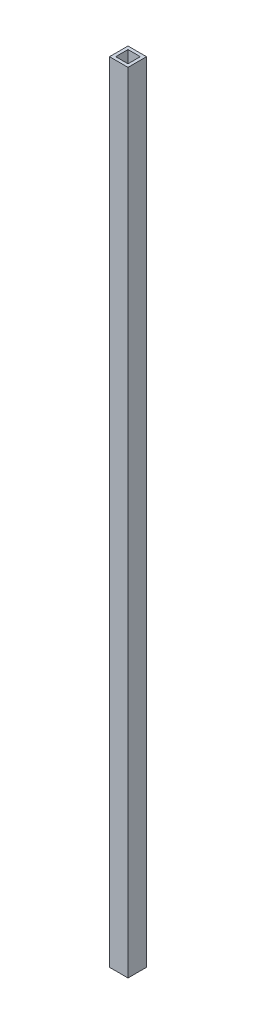
ISO-10303-21;
HEADER;
FILE_DESCRIPTION(('STEP AP214'),'2;1');
FILE_NAME('part.step','',(''),(''),'','','');
FILE_SCHEMA(('AUTOMOTIVE_DESIGN { 1 0 10303 214 1 1 1 1 }'));
ENDSEC;
DATA;
#1=APPLICATION_CONTEXT('core data for automotive mechanical design processes');
#2=APPLICATION_PROTOCOL_DEFINITION('international standard','automotive_design',2000,#1);
#3=PRODUCT_CONTEXT('',#1,'mechanical');
#4=PRODUCT('Part','Part','',(#3));
#5=PRODUCT_RELATED_PRODUCT_CATEGORY('part','',(#4));
#6=PRODUCT_DEFINITION_FORMATION('','',#4);
#7=PRODUCT_DEFINITION_CONTEXT('part definition',#1,'design');
#8=PRODUCT_DEFINITION('design','',#6,#7);
#9=PRODUCT_DEFINITION_SHAPE('','',#8);
#10=(LENGTH_UNIT() NAMED_UNIT(*) SI_UNIT(.MILLI.,.METRE.));
#11=(NAMED_UNIT(*) PLANE_ANGLE_UNIT() SI_UNIT($,.RADIAN.));
#12=(NAMED_UNIT(*) SI_UNIT($,.STERADIAN.) SOLID_ANGLE_UNIT());
#13=UNCERTAINTY_MEASURE_WITH_UNIT(LENGTH_MEASURE(1.E-05),#10,'distance_accuracy_value','');
#14=(GEOMETRIC_REPRESENTATION_CONTEXT(3) GLOBAL_UNCERTAINTY_ASSIGNED_CONTEXT((#13)) GLOBAL_UNIT_ASSIGNED_CONTEXT((#10,
#11,#12)) REPRESENTATION_CONTEXT('',''));
#15=CARTESIAN_POINT('',(0.,0.,0.));
#16=DIRECTION('',(0.,0.,1.));
#17=DIRECTION('',(1.,0.,0.));
#18=AXIS2_PLACEMENT_3D('',#15,#16,#17);
#19=CARTESIAN_POINT('',(0.,812.8,0.));
#20=DIRECTION('',(0.,1.,0.));
#21=DIRECTION('',(0.,0.,1.));
#22=AXIS2_PLACEMENT_3D('',#19,#20,#21);
#23=PLANE('',#22);
#24=DIRECTION('',(0.,0.,1.));
#25=VECTOR('',#24,1.);
#26=CARTESIAN_POINT('',(0.,812.8,0.));
#27=LINE('',#26,#25);
#28=CARTESIAN_POINT('',(0.,812.8,-19.05));
#29=VERTEX_POINT('',#28);
#30=CARTESIAN_POINT('',(0.,812.8,0.));
#31=VERTEX_POINT('',#30);
#32=EDGE_CURVE('E158',#29,#31,#27,.T.);
#33=ORIENTED_EDGE('',*,*,#32,.T.);
#34=DIRECTION('',(1.,0.,0.));
#35=VECTOR('',#34,1.);
#36=CARTESIAN_POINT('',(0.,812.8,0.));
#37=LINE('',#36,#35);
#38=CARTESIAN_POINT('',(19.05,812.8,0.));
#39=VERTEX_POINT('',#38);
#40=EDGE_CURVE('E161',#31,#39,#37,.T.);
#41=ORIENTED_EDGE('',*,*,#40,.T.);
#42=DIRECTION('',(0.,0.,-1.));
#43=VECTOR('',#42,1.);
#44=CARTESIAN_POINT('',(19.05,812.8,0.));
#45=LINE('',#44,#43);
#46=CARTESIAN_POINT('',(19.05,812.8,-19.05));
#47=VERTEX_POINT('',#46);
#48=EDGE_CURVE('E164',#39,#47,#45,.T.);
#49=ORIENTED_EDGE('',*,*,#48,.T.);
#50=DIRECTION('',(-1.,0.,0.));
#51=VECTOR('',#50,1.);
#52=CARTESIAN_POINT('',(0.,812.8,-19.05));
#53=LINE('',#52,#51);
#54=EDGE_CURVE('E166',#47,#29,#53,.T.);
#55=ORIENTED_EDGE('',*,*,#54,.T.);
#56=EDGE_LOOP('',(#33,#41,#49,#55));
#57=FACE_BOUND('',#56,.T.);
#58=DIRECTION('',(1.,0.,0.));
#59=VECTOR('',#58,1.);
#60=CARTESIAN_POINT('',(0.,812.8,-3.175));
#61=LINE('',#60,#59);
#62=CARTESIAN_POINT('',(3.175,812.8,-3.175));
#63=VERTEX_POINT('',#62);
#64=CARTESIAN_POINT('',(15.875,812.8,-3.175));
#65=VERTEX_POINT('',#64);
#66=EDGE_CURVE('E130',#63,#65,#61,.T.);
#67=ORIENTED_EDGE('',*,*,#66,.F.);
#68=DIRECTION('',(0.,0.,1.));
#69=VECTOR('',#68,1.);
#70=CARTESIAN_POINT('',(3.175,812.8,0.));
#71=LINE('',#70,#69);
#72=CARTESIAN_POINT('',(3.175,812.8,-15.875));
#73=VERTEX_POINT('',#72);
#74=EDGE_CURVE('E122',#73,#63,#71,.T.);
#75=ORIENTED_EDGE('',*,*,#74,.F.);
#76=DIRECTION('',(-1.,0.,0.));
#77=VECTOR('',#76,1.);
#78=CARTESIAN_POINT('',(0.,812.8,-15.875));
#79=LINE('',#78,#77);
#80=CARTESIAN_POINT('',(15.875,812.8,-15.875));
#81=VERTEX_POINT('',#80);
#82=EDGE_CURVE('E144',#81,#73,#79,.T.);
#83=ORIENTED_EDGE('',*,*,#82,.F.);
#84=DIRECTION('',(0.,0.,-1.));
#85=VECTOR('',#84,1.);
#86=CARTESIAN_POINT('',(15.875,812.8,0.));
#87=LINE('',#86,#85);
#88=EDGE_CURVE('E142',#65,#81,#87,.T.);
#89=ORIENTED_EDGE('',*,*,#88,.F.);
#90=EDGE_LOOP('',(#67,#75,#83,#89));
#91=FACE_BOUND('',#90,.T.);
#92=ADVANCED_FACE('F57',(#57,#91),#23,.T.);
#93=CARTESIAN_POINT('',(0.,0.,0.));
#94=DIRECTION('',(0.,1.,0.));
#95=DIRECTION('',(0.,0.,1.));
#96=AXIS2_PLACEMENT_3D('',#93,#94,#95);
#97=PLANE('',#96);
#98=DIRECTION('',(0.,0.,1.));
#99=VECTOR('',#98,1.);
#100=CARTESIAN_POINT('',(0.,0.,0.));
#101=LINE('',#100,#99);
#102=CARTESIAN_POINT('',(0.,0.,-19.05));
#103=VERTEX_POINT('',#102);
#104=CARTESIAN_POINT('',(0.,0.,0.));
#105=VERTEX_POINT('',#104);
#106=EDGE_CURVE('E138',#103,#105,#101,.T.);
#107=ORIENTED_EDGE('',*,*,#106,.F.);
#108=DIRECTION('',(-1.,0.,0.));
#109=VECTOR('',#108,1.);
#110=CARTESIAN_POINT('',(0.,0.,-19.05));
#111=LINE('',#110,#109);
#112=CARTESIAN_POINT('',(19.05,0.,-19.05));
#113=VERTEX_POINT('',#112);
#114=EDGE_CURVE('E162',#113,#103,#111,.T.);
#115=ORIENTED_EDGE('',*,*,#114,.F.);
#116=DIRECTION('',(0.,0.,-1.));
#117=VECTOR('',#116,1.);
#118=CARTESIAN_POINT('',(19.05,0.,0.));
#119=LINE('',#118,#117);
#120=CARTESIAN_POINT('',(19.05,0.,0.));
#121=VERTEX_POINT('',#120);
#122=EDGE_CURVE('E173',#121,#113,#119,.T.);
#123=ORIENTED_EDGE('',*,*,#122,.F.);
#124=DIRECTION('',(1.,0.,0.));
#125=VECTOR('',#124,1.);
#126=CARTESIAN_POINT('',(0.,0.,0.));
#127=LINE('',#126,#125);
#128=EDGE_CURVE('E171',#105,#121,#127,.T.);
#129=ORIENTED_EDGE('',*,*,#128,.F.);
#130=EDGE_LOOP('',(#107,#115,#123,#129));
#131=FACE_BOUND('',#130,.T.);
#132=DIRECTION('',(0.,0.,1.));
#133=VECTOR('',#132,1.);
#134=CARTESIAN_POINT('',(3.175,0.,0.));
#135=LINE('',#134,#133);
#136=CARTESIAN_POINT('',(3.175,0.,-15.875));
#137=VERTEX_POINT('',#136);
#138=CARTESIAN_POINT('',(3.175,0.,-3.175));
#139=VERTEX_POINT('',#138);
#140=EDGE_CURVE('E80',#137,#139,#135,.T.);
#141=ORIENTED_EDGE('',*,*,#140,.T.);
#142=DIRECTION('',(1.,0.,0.));
#143=VECTOR('',#142,1.);
#144=CARTESIAN_POINT('',(0.,0.,-3.175));
#145=LINE('',#144,#143);
#146=CARTESIAN_POINT('',(15.875,0.,-3.175));
#147=VERTEX_POINT('',#146);
#148=EDGE_CURVE('E137',#139,#147,#145,.T.);
#149=ORIENTED_EDGE('',*,*,#148,.T.);
#150=DIRECTION('',(0.,0.,-1.));
#151=VECTOR('',#150,1.);
#152=CARTESIAN_POINT('',(15.875,0.,0.));
#153=LINE('',#152,#151);
#154=CARTESIAN_POINT('',(15.875,0.,-15.875));
#155=VERTEX_POINT('',#154);
#156=EDGE_CURVE('E150',#147,#155,#153,.T.);
#157=ORIENTED_EDGE('',*,*,#156,.T.);
#158=DIRECTION('',(-1.,0.,0.));
#159=VECTOR('',#158,1.);
#160=CARTESIAN_POINT('',(0.,0.,-15.875));
#161=LINE('',#160,#159);
#162=EDGE_CURVE('E131',#155,#137,#161,.T.);
#163=ORIENTED_EDGE('',*,*,#162,.T.);
#164=EDGE_LOOP('',(#141,#149,#157,#163));
#165=FACE_BOUND('',#164,.T.);
#166=ADVANCED_FACE('F191',(#131,#165),#97,.F.);
#167=CARTESIAN_POINT('',(0.,812.8,0.));
#168=DIRECTION('',(1.,0.,0.));
#169=DIRECTION('',(0.,0.,-1.));
#170=AXIS2_PLACEMENT_3D('',#167,#168,#169);
#171=PLANE('',#170);
#172=ORIENTED_EDGE('',*,*,#106,.T.);
#173=DIRECTION('',(0.,-1.,0.));
#174=VECTOR('',#173,1.);
#175=CARTESIAN_POINT('',(0.,812.8,0.));
#176=LINE('',#175,#174);
#177=EDGE_CURVE('E12',#31,#105,#176,.T.);
#178=ORIENTED_EDGE('',*,*,#177,.F.);
#179=ORIENTED_EDGE('',*,*,#32,.F.);
#180=DIRECTION('',(0.,-1.,0.));
#181=VECTOR('',#180,1.);
#182=CARTESIAN_POINT('',(0.,812.8,-19.05));
#183=LINE('',#182,#181);
#184=EDGE_CURVE('E168',#29,#103,#183,.T.);
#185=ORIENTED_EDGE('',*,*,#184,.T.);
#186=EDGE_LOOP('',(#172,#178,#179,#185));
#187=FACE_BOUND('',#186,.T.);
#188=ADVANCED_FACE('F59',(#187),#171,.F.);
#189=CARTESIAN_POINT('',(0.,812.8,0.));
#190=DIRECTION('',(0.,0.,-1.));
#191=DIRECTION('',(-1.,0.,0.));
#192=AXIS2_PLACEMENT_3D('',#189,#190,#191);
#193=PLANE('',#192);
#194=ORIENTED_EDGE('',*,*,#128,.T.);
#195=DIRECTION('',(0.,-1.,0.));
#196=VECTOR('',#195,1.);
#197=CARTESIAN_POINT('',(19.05,812.8,0.));
#198=LINE('',#197,#196);
#199=EDGE_CURVE('E65',#39,#121,#198,.T.);
#200=ORIENTED_EDGE('',*,*,#199,.F.);
#201=ORIENTED_EDGE('',*,*,#40,.F.);
#202=ORIENTED_EDGE('',*,*,#177,.T.);
#203=EDGE_LOOP('',(#194,#200,#201,#202));
#204=FACE_BOUND('',#203,.T.);
#205=ADVANCED_FACE('F201',(#204),#193,.F.);
#206=CARTESIAN_POINT('',(19.05,812.8,0.));
#207=DIRECTION('',(-1.,0.,0.));
#208=DIRECTION('',(0.,0.,1.));
#209=AXIS2_PLACEMENT_3D('',#206,#207,#208);
#210=PLANE('',#209);
#211=ORIENTED_EDGE('',*,*,#122,.T.);
#212=DIRECTION('',(0.,-1.,0.));
#213=VECTOR('',#212,1.);
#214=CARTESIAN_POINT('',(19.05,812.8,-19.05));
#215=LINE('',#214,#213);
#216=EDGE_CURVE('E178',#47,#113,#215,.T.);
#217=ORIENTED_EDGE('',*,*,#216,.F.);
#218=ORIENTED_EDGE('',*,*,#48,.F.);
#219=ORIENTED_EDGE('',*,*,#199,.T.);
#220=EDGE_LOOP('',(#211,#217,#218,#219));
#221=FACE_BOUND('',#220,.T.);
#222=ADVANCED_FACE('F185',(#221),#210,.F.);
#223=CARTESIAN_POINT('',(0.,812.8,-19.05));
#224=DIRECTION('',(0.,0.,1.));
#225=DIRECTION('',(1.,0.,0.));
#226=AXIS2_PLACEMENT_3D('',#223,#224,#225);
#227=PLANE('',#226);
#228=ORIENTED_EDGE('',*,*,#114,.T.);
#229=ORIENTED_EDGE('',*,*,#184,.F.);
#230=ORIENTED_EDGE('',*,*,#54,.F.);
#231=ORIENTED_EDGE('',*,*,#216,.T.);
#232=EDGE_LOOP('',(#228,#229,#230,#231));
#233=FACE_BOUND('',#232,.T.);
#234=ADVANCED_FACE('F195',(#233),#227,.F.);
#235=CARTESIAN_POINT('',(3.175,812.8,0.));
#236=DIRECTION('',(1.,0.,0.));
#237=DIRECTION('',(0.,0.,-1.));
#238=AXIS2_PLACEMENT_3D('',#235,#236,#237);
#239=PLANE('',#238);
#240=ORIENTED_EDGE('',*,*,#140,.F.);
#241=DIRECTION('',(0.,-1.,0.));
#242=VECTOR('',#241,1.);
#243=CARTESIAN_POINT('',(3.175,812.8,-15.875));
#244=LINE('',#243,#242);
#245=EDGE_CURVE('E126',#73,#137,#244,.T.);
#246=ORIENTED_EDGE('',*,*,#245,.F.);
#247=ORIENTED_EDGE('',*,*,#74,.T.);
#248=DIRECTION('',(0.,-1.,0.));
#249=VECTOR('',#248,1.);
#250=CARTESIAN_POINT('',(3.175,812.8,-3.175));
#251=LINE('',#250,#249);
#252=EDGE_CURVE('E125',#63,#139,#251,.T.);
#253=ORIENTED_EDGE('',*,*,#252,.T.);
#254=EDGE_LOOP('',(#240,#246,#247,#253));
#255=FACE_BOUND('',#254,.T.);
#256=ADVANCED_FACE('F124',(#255),#239,.T.);
#257=CARTESIAN_POINT('',(0.,812.8,-3.175));
#258=DIRECTION('',(0.,0.,-1.));
#259=DIRECTION('',(-1.,0.,0.));
#260=AXIS2_PLACEMENT_3D('',#257,#258,#259);
#261=PLANE('',#260);
#262=ORIENTED_EDGE('',*,*,#148,.F.);
#263=ORIENTED_EDGE('',*,*,#252,.F.);
#264=ORIENTED_EDGE('',*,*,#66,.T.);
#265=DIRECTION('',(0.,-1.,0.));
#266=VECTOR('',#265,1.);
#267=CARTESIAN_POINT('',(15.875,812.8,-3.175));
#268=LINE('',#267,#266);
#269=EDGE_CURVE('E139',#65,#147,#268,.T.);
#270=ORIENTED_EDGE('',*,*,#269,.T.);
#271=EDGE_LOOP('',(#262,#263,#264,#270));
#272=FACE_BOUND('',#271,.T.);
#273=ADVANCED_FACE('F134',(#272),#261,.T.);
#274=CARTESIAN_POINT('',(15.875,812.8,0.));
#275=DIRECTION('',(-1.,0.,0.));
#276=DIRECTION('',(0.,0.,1.));
#277=AXIS2_PLACEMENT_3D('',#274,#275,#276);
#278=PLANE('',#277);
#279=ORIENTED_EDGE('',*,*,#156,.F.);
#280=ORIENTED_EDGE('',*,*,#269,.F.);
#281=ORIENTED_EDGE('',*,*,#88,.T.);
#282=DIRECTION('',(0.,-1.,0.));
#283=VECTOR('',#282,1.);
#284=CARTESIAN_POINT('',(15.875,812.8,-15.875));
#285=LINE('',#284,#283);
#286=EDGE_CURVE('E72',#81,#155,#285,.T.);
#287=ORIENTED_EDGE('',*,*,#286,.T.);
#288=EDGE_LOOP('',(#279,#280,#281,#287));
#289=FACE_BOUND('',#288,.T.);
#290=ADVANCED_FACE('F224',(#289),#278,.T.);
#291=CARTESIAN_POINT('',(0.,812.8,-15.875));
#292=DIRECTION('',(0.,0.,1.));
#293=DIRECTION('',(1.,0.,0.));
#294=AXIS2_PLACEMENT_3D('',#291,#292,#293);
#295=PLANE('',#294);
#296=ORIENTED_EDGE('',*,*,#162,.F.);
#297=ORIENTED_EDGE('',*,*,#286,.F.);
#298=ORIENTED_EDGE('',*,*,#82,.T.);
#299=ORIENTED_EDGE('',*,*,#245,.T.);
#300=EDGE_LOOP('',(#296,#297,#298,#299));
#301=FACE_BOUND('',#300,.T.);
#302=ADVANCED_FACE('F228',(#301),#295,.T.);
#303=CLOSED_SHELL('',(#92,#166,#188,#205,#222,#234,#256,#273,#290,#302));
#304=MANIFOLD_SOLID_BREP('B2',#303);
#305=ADVANCED_BREP_SHAPE_REPRESENTATION('',(#18,#304),#14);
#306=SHAPE_DEFINITION_REPRESENTATION(#9,#305);
ENDSEC;
END-ISO-10303-21;
